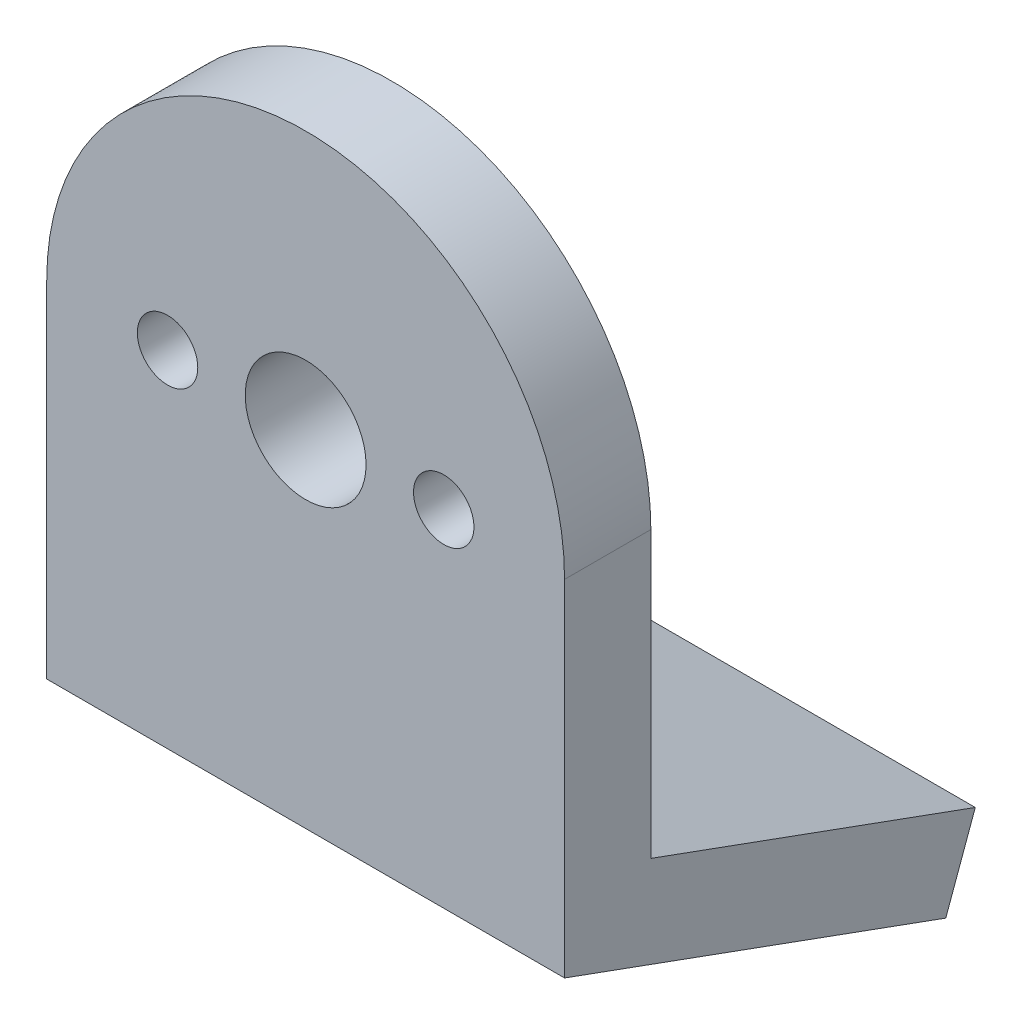
ISO-10303-21;
HEADER;
FILE_DESCRIPTION(('STEP AP214'),'2;1');
FILE_NAME('part.step','',(''),(''),'','','');
FILE_SCHEMA(('AUTOMOTIVE_DESIGN { 1 0 10303 214 1 1 1 1 }'));
ENDSEC;
DATA;
#1=APPLICATION_CONTEXT('core data for automotive mechanical design processes');
#2=APPLICATION_PROTOCOL_DEFINITION('international standard','automotive_design',2000,#1);
#3=PRODUCT_CONTEXT('',#1,'mechanical');
#4=PRODUCT('Part','Part','',(#3));
#5=PRODUCT_RELATED_PRODUCT_CATEGORY('part','',(#4));
#6=PRODUCT_DEFINITION_FORMATION('','',#4);
#7=PRODUCT_DEFINITION_CONTEXT('part definition',#1,'design');
#8=PRODUCT_DEFINITION('design','',#6,#7);
#9=PRODUCT_DEFINITION_SHAPE('','',#8);
#10=(LENGTH_UNIT() NAMED_UNIT(*) SI_UNIT(.MILLI.,.METRE.));
#11=(NAMED_UNIT(*) PLANE_ANGLE_UNIT() SI_UNIT($,.RADIAN.));
#12=(NAMED_UNIT(*) SI_UNIT($,.STERADIAN.) SOLID_ANGLE_UNIT());
#13=UNCERTAINTY_MEASURE_WITH_UNIT(LENGTH_MEASURE(1.E-05),#10,'distance_accuracy_value','');
#14=(GEOMETRIC_REPRESENTATION_CONTEXT(3) GLOBAL_UNCERTAINTY_ASSIGNED_CONTEXT((#13)) GLOBAL_UNIT_ASSIGNED_CONTEXT((#10,
#11,#12)) REPRESENTATION_CONTEXT('',''));
#15=CARTESIAN_POINT('',(0.,0.,0.));
#16=DIRECTION('',(0.,0.,1.));
#17=DIRECTION('',(1.,0.,0.));
#18=AXIS2_PLACEMENT_3D('',#15,#16,#17);
#19=CARTESIAN_POINT('',(-0.959557323541412,10.3488372093023,5.));
#20=DIRECTION('',(0.,0.,1.));
#21=DIRECTION('',(1.,0.,0.));
#22=AXIS2_PLACEMENT_3D('',#19,#20,#21);
#23=PLANE('',#22);
#24=CARTESIAN_POINT('',(7.04044267645859,10.3488372093023,5.));
#25=DIRECTION('',(0.,0.,1.));
#26=DIRECTION('',(1.,0.,0.));
#27=AXIS2_PLACEMENT_3D('',#24,#25,#26);
#28=CIRCLE('',#27,1.75);
#29=CARTESIAN_POINT('',(8.79044267645859,10.3488372093023,5.));
#30=VERTEX_POINT('',#29);
#31=EDGE_CURVE('E111',#30,#30,#28,.T.);
#32=ORIENTED_EDGE('',*,*,#31,.F.);
#33=EDGE_LOOP('',(#32));
#34=FACE_BOUND('',#33,.T.);
#35=CARTESIAN_POINT('',(-0.959557323541412,10.3488372093023,5.));
#36=DIRECTION('',(0.,0.,1.));
#37=DIRECTION('',(1.,0.,0.));
#38=AXIS2_PLACEMENT_3D('',#35,#36,#37);
#39=CIRCLE('',#38,15.);
#40=CARTESIAN_POINT('',(14.0404426764586,10.3488372093023,5.));
#41=VERTEX_POINT('',#40);
#42=CARTESIAN_POINT('',(-15.9595573235414,10.3488372093023,5.));
#43=VERTEX_POINT('',#42);
#44=EDGE_CURVE('E90',#41,#43,#39,.T.);
#45=ORIENTED_EDGE('',*,*,#44,.T.);
#46=DIRECTION('',(0.,-1.,0.));
#47=VECTOR('',#46,1.);
#48=CARTESIAN_POINT('',(-15.9595573235414,10.3488372093023,5.));
#49=LINE('',#48,#47);
#50=CARTESIAN_POINT('',(-15.9595573235414,-9.65116279069768,5.));
#51=VERTEX_POINT('',#50);
#52=EDGE_CURVE('E82',#43,#51,#49,.T.);
#53=ORIENTED_EDGE('',*,*,#52,.T.);
#54=DIRECTION('',(1.,0.,0.));
#55=VECTOR('',#54,1.);
#56=CARTESIAN_POINT('',(-15.9595573235414,-9.65116279069768,5.));
#57=LINE('',#56,#55);
#58=CARTESIAN_POINT('',(14.0404426764586,-9.65116279069768,5.));
#59=VERTEX_POINT('',#58);
#60=EDGE_CURVE('E89',#51,#59,#57,.T.);
#61=ORIENTED_EDGE('',*,*,#60,.T.);
#62=DIRECTION('',(0.,1.,0.));
#63=VECTOR('',#62,1.);
#64=CARTESIAN_POINT('',(14.0404426764586,10.3488372093023,5.));
#65=LINE('',#64,#63);
#66=EDGE_CURVE('E51',#59,#41,#65,.T.);
#67=ORIENTED_EDGE('',*,*,#66,.T.);
#68=EDGE_LOOP('',(#45,#53,#61,#67));
#69=FACE_BOUND('',#68,.T.);
#70=CARTESIAN_POINT('',(-8.95955732354141,10.3488372093023,5.));
#71=DIRECTION('',(0.,0.,1.));
#72=DIRECTION('',(1.,0.,0.));
#73=AXIS2_PLACEMENT_3D('',#70,#71,#72);
#74=CIRCLE('',#73,1.75);
#75=CARTESIAN_POINT('',(-7.20955732354141,10.3488372093023,5.));
#76=VERTEX_POINT('',#75);
#77=EDGE_CURVE('E100',#76,#76,#74,.T.);
#78=ORIENTED_EDGE('',*,*,#77,.F.);
#79=EDGE_LOOP('',(#78));
#80=FACE_BOUND('',#79,.T.);
#81=CARTESIAN_POINT('',(-0.959557323541412,10.3488372093023,5.));
#82=DIRECTION('',(0.,0.,1.));
#83=DIRECTION('',(1.,0.,0.));
#84=AXIS2_PLACEMENT_3D('',#81,#82,#83);
#85=CIRCLE('',#84,3.5);
#86=CARTESIAN_POINT('',(2.54044267645859,10.3488372093023,5.));
#87=VERTEX_POINT('',#86);
#88=EDGE_CURVE('E116',#87,#87,#85,.T.);
#89=ORIENTED_EDGE('',*,*,#88,.F.);
#90=EDGE_LOOP('',(#89));
#91=FACE_BOUND('',#90,.T.);
#92=ADVANCED_FACE('F34',(#34,#69,#80,#91),#23,.T.);
#93=CARTESIAN_POINT('',(-0.959557323541412,10.3488372093023,0.));
#94=DIRECTION('',(0.,0.,1.));
#95=DIRECTION('',(1.,0.,0.));
#96=AXIS2_PLACEMENT_3D('',#93,#94,#95);
#97=PLANE('',#96);
#98=CARTESIAN_POINT('',(7.04044267645859,10.3488372093023,0.));
#99=DIRECTION('',(0.,0.,1.));
#100=DIRECTION('',(1.,0.,0.));
#101=AXIS2_PLACEMENT_3D('',#98,#99,#100);
#102=CIRCLE('',#101,1.75);
#103=CARTESIAN_POINT('',(8.79044267645859,10.3488372093023,0.));
#104=VERTEX_POINT('',#103);
#105=EDGE_CURVE('E113',#104,#104,#102,.T.);
#106=ORIENTED_EDGE('',*,*,#105,.T.);
#107=EDGE_LOOP('',(#106));
#108=FACE_BOUND('',#107,.T.);
#109=DIRECTION('',(0.,1.,0.));
#110=VECTOR('',#109,1.);
#111=CARTESIAN_POINT('',(14.0404426764586,10.3488372093023,0.));
#112=LINE('',#111,#110);
#113=CARTESIAN_POINT('',(14.0404426764586,-6.15012509964911,0.));
#114=VERTEX_POINT('',#113);
#115=CARTESIAN_POINT('',(14.0404426764586,10.3488372093023,0.));
#116=VERTEX_POINT('',#115);
#117=EDGE_CURVE('E96',#114,#116,#112,.T.);
#118=ORIENTED_EDGE('',*,*,#117,.F.);
#119=DIRECTION('',(-1.,0.,0.));
#120=VECTOR('',#119,1.);
#121=CARTESIAN_POINT('',(14.0414426764586,-6.15012509964911,0.));
#122=LINE('',#121,#120);
#123=CARTESIAN_POINT('',(-15.9595573235414,-6.15012509964911,0.));
#124=VERTEX_POINT('',#123);
#125=EDGE_CURVE('E122',#114,#124,#122,.T.);
#126=ORIENTED_EDGE('',*,*,#125,.T.);
#127=DIRECTION('',(0.,-1.,0.));
#128=VECTOR('',#127,1.);
#129=CARTESIAN_POINT('',(-15.9595573235414,10.3488372093023,0.));
#130=LINE('',#129,#128);
#131=CARTESIAN_POINT('',(-15.9595573235414,10.3488372093023,0.));
#132=VERTEX_POINT('',#131);
#133=EDGE_CURVE('E64',#132,#124,#130,.T.);
#134=ORIENTED_EDGE('',*,*,#133,.F.);
#135=CARTESIAN_POINT('',(-0.959557323541412,10.3488372093023,0.));
#136=DIRECTION('',(0.,0.,1.));
#137=DIRECTION('',(1.,0.,0.));
#138=AXIS2_PLACEMENT_3D('',#135,#136,#137);
#139=CIRCLE('',#138,15.);
#140=EDGE_CURVE('E98',#116,#132,#139,.T.);
#141=ORIENTED_EDGE('',*,*,#140,.F.);
#142=EDGE_LOOP('',(#118,#126,#134,#141));
#143=FACE_BOUND('',#142,.T.);
#144=CARTESIAN_POINT('',(-8.95955732354141,10.3488372093023,0.));
#145=DIRECTION('',(0.,0.,1.));
#146=DIRECTION('',(1.,0.,0.));
#147=AXIS2_PLACEMENT_3D('',#144,#145,#146);
#148=CIRCLE('',#147,1.75);
#149=CARTESIAN_POINT('',(-7.20955732354141,10.3488372093023,0.));
#150=VERTEX_POINT('',#149);
#151=EDGE_CURVE('E104',#150,#150,#148,.T.);
#152=ORIENTED_EDGE('',*,*,#151,.T.);
#153=EDGE_LOOP('',(#152));
#154=FACE_BOUND('',#153,.T.);
#155=CARTESIAN_POINT('',(-0.959557323541412,10.3488372093023,0.));
#156=DIRECTION('',(0.,0.,1.));
#157=DIRECTION('',(1.,0.,0.));
#158=AXIS2_PLACEMENT_3D('',#155,#156,#157);
#159=CIRCLE('',#158,3.5);
#160=CARTESIAN_POINT('',(2.54044267645859,10.3488372093023,0.));
#161=VERTEX_POINT('',#160);
#162=EDGE_CURVE('E119',#161,#161,#159,.T.);
#163=ORIENTED_EDGE('',*,*,#162,.T.);
#164=EDGE_LOOP('',(#163));
#165=FACE_BOUND('',#164,.T.);
#166=ADVANCED_FACE('F162',(#108,#143,#154,#165),#97,.F.);
#167=CARTESIAN_POINT('',(-0.959557323541412,10.3488372093023,5.));
#168=DIRECTION('',(0.,0.,-1.));
#169=DIRECTION('',(-1.,0.,0.));
#170=AXIS2_PLACEMENT_3D('',#167,#168,#169);
#171=CYLINDRICAL_SURFACE('',#170,15.);
#172=ORIENTED_EDGE('',*,*,#140,.T.);
#173=DIRECTION('',(0.,0.,-1.));
#174=VECTOR('',#173,1.);
#175=CARTESIAN_POINT('',(-15.9595573235414,10.3488372093023,5.));
#176=LINE('',#175,#174);
#177=EDGE_CURVE('E11',#43,#132,#176,.T.);
#178=ORIENTED_EDGE('',*,*,#177,.F.);
#179=ORIENTED_EDGE('',*,*,#44,.F.);
#180=DIRECTION('',(0.,0.,-1.));
#181=VECTOR('',#180,1.);
#182=CARTESIAN_POINT('',(14.0404426764586,10.3488372093023,5.));
#183=LINE('',#182,#181);
#184=EDGE_CURVE('E43',#41,#116,#183,.T.);
#185=ORIENTED_EDGE('',*,*,#184,.T.);
#186=EDGE_LOOP('',(#172,#178,#179,#185));
#187=FACE_BOUND('',#186,.T.);
#188=ADVANCED_FACE('F36',(#187),#171,.T.);
#189=CARTESIAN_POINT('',(-15.9595573235414,10.3488372093023,5.));
#190=DIRECTION('',(1.,0.,0.));
#191=DIRECTION('',(0.,0.,-1.));
#192=AXIS2_PLACEMENT_3D('',#189,#190,#191);
#193=PLANE('',#192);
#194=ORIENTED_EDGE('',*,*,#133,.T.);
#195=DIRECTION('',(0.,0.342020143325663,0.93969262078591));
#196=VECTOR('',#195,1.);
#197=CARTESIAN_POINT('',(-15.9595573235414,-12.9905279661624,-18.7938524157182));
#198=LINE('',#197,#196);
#199=CARTESIAN_POINT('',(-15.9595573235414,-12.9905279661624,-18.7938524157182));
#200=VERTEX_POINT('',#199);
#201=EDGE_CURVE('E73',#200,#124,#198,.T.);
#202=ORIENTED_EDGE('',*,*,#201,.F.);
#203=DIRECTION('',(0.,0.93969262078591,-0.342020143325663));
#204=VECTOR('',#203,1.);
#205=CARTESIAN_POINT('',(-15.9595573235414,-12.9905279661624,-18.7938524157182));
#206=LINE('',#205,#204);
#207=CARTESIAN_POINT('',(-15.9595573235414,-17.6889910700919,-17.0837516990899));
#208=VERTEX_POINT('',#207);
#209=EDGE_CURVE('E142',#208,#200,#206,.T.);
#210=ORIENTED_EDGE('',*,*,#209,.F.);
#211=DIRECTION('',(0.,0.342020143325664,0.93969262078591));
#212=VECTOR('',#211,1.);
#213=CARTESIAN_POINT('',(-15.9595573235414,-9.65116279069768,5.));
#214=LINE('',#213,#212);
#215=EDGE_CURVE('E88',#208,#51,#214,.T.);
#216=ORIENTED_EDGE('',*,*,#215,.T.);
#217=ORIENTED_EDGE('',*,*,#52,.F.);
#218=ORIENTED_EDGE('',*,*,#177,.T.);
#219=EDGE_LOOP('',(#194,#202,#210,#216,#217,#218));
#220=FACE_BOUND('',#219,.T.);
#221=ADVANCED_FACE('F83',(#220),#193,.F.);
#222=CARTESIAN_POINT('',(14.0404426764586,10.3488372093023,5.));
#223=DIRECTION('',(-1.,0.,0.));
#224=DIRECTION('',(0.,-1.,0.));
#225=AXIS2_PLACEMENT_3D('',#222,#223,#224);
#226=PLANE('',#225);
#227=ORIENTED_EDGE('',*,*,#66,.F.);
#228=DIRECTION('',(0.,0.342020143325664,0.93969262078591));
#229=VECTOR('',#228,1.);
#230=CARTESIAN_POINT('',(14.0404426764586,-9.65116279069768,5.));
#231=LINE('',#230,#229);
#232=CARTESIAN_POINT('',(14.0404426764586,-17.6889910700919,-17.0837516990899));
#233=VERTEX_POINT('',#232);
#234=EDGE_CURVE('E126',#233,#59,#231,.T.);
#235=ORIENTED_EDGE('',*,*,#234,.F.);
#236=DIRECTION('',(0.,-0.93969262078591,0.342020143325663));
#237=VECTOR('',#236,1.);
#238=CARTESIAN_POINT('',(14.0404426764586,-12.9905279661624,-18.7938524157182));
#239=LINE('',#238,#237);
#240=CARTESIAN_POINT('',(14.0404426764586,-12.9905279661624,-18.7938524157182));
#241=VERTEX_POINT('',#240);
#242=EDGE_CURVE('E136',#241,#233,#239,.T.);
#243=ORIENTED_EDGE('',*,*,#242,.F.);
#244=DIRECTION('',(0.,0.342020143325663,0.93969262078591));
#245=VECTOR('',#244,1.);
#246=CARTESIAN_POINT('',(14.0404426764586,-12.9905279661624,-18.7938524157182));
#247=LINE('',#246,#245);
#248=EDGE_CURVE('E130',#241,#114,#247,.T.);
#249=ORIENTED_EDGE('',*,*,#248,.T.);
#250=ORIENTED_EDGE('',*,*,#117,.T.);
#251=ORIENTED_EDGE('',*,*,#184,.F.);
#252=EDGE_LOOP('',(#227,#235,#243,#249,#250,#251));
#253=FACE_BOUND('',#252,.T.);
#254=ADVANCED_FACE('F161',(#253),#226,.F.);
#255=CARTESIAN_POINT('',(-8.95955732354141,10.3488372093023,5.));
#256=DIRECTION('',(0.,0.,-1.));
#257=DIRECTION('',(-1.,0.,0.));
#258=AXIS2_PLACEMENT_3D('',#255,#256,#257);
#259=CYLINDRICAL_SURFACE('',#258,1.75);
#260=ORIENTED_EDGE('',*,*,#77,.T.);
#261=EDGE_LOOP('',(#260));
#262=FACE_BOUND('',#261,.T.);
#263=ORIENTED_EDGE('',*,*,#151,.F.);
#264=EDGE_LOOP('',(#263));
#265=FACE_BOUND('',#264,.T.);
#266=ADVANCED_FACE('F182',(#262,#265),#259,.F.);
#267=CARTESIAN_POINT('',(7.04044267645859,10.3488372093023,5.));
#268=DIRECTION('',(0.,0.,-1.));
#269=DIRECTION('',(-1.,0.,0.));
#270=AXIS2_PLACEMENT_3D('',#267,#268,#269);
#271=CYLINDRICAL_SURFACE('',#270,1.75);
#272=ORIENTED_EDGE('',*,*,#31,.T.);
#273=EDGE_LOOP('',(#272));
#274=FACE_BOUND('',#273,.T.);
#275=ORIENTED_EDGE('',*,*,#105,.F.);
#276=EDGE_LOOP('',(#275));
#277=FACE_BOUND('',#276,.T.);
#278=ADVANCED_FACE('F174',(#274,#277),#271,.F.);
#279=CARTESIAN_POINT('',(-0.959557323541412,10.3488372093023,5.));
#280=DIRECTION('',(0.,0.,-1.));
#281=DIRECTION('',(-1.,0.,0.));
#282=AXIS2_PLACEMENT_3D('',#279,#280,#281);
#283=CYLINDRICAL_SURFACE('',#282,3.5);
#284=ORIENTED_EDGE('',*,*,#88,.T.);
#285=EDGE_LOOP('',(#284));
#286=FACE_BOUND('',#285,.T.);
#287=ORIENTED_EDGE('',*,*,#162,.F.);
#288=EDGE_LOOP('',(#287));
#289=FACE_BOUND('',#288,.T.);
#290=ADVANCED_FACE('F171',(#286,#289),#283,.F.);
#291=CARTESIAN_POINT('',(14.0404426764586,-9.65116279069768,5.));
#292=DIRECTION('',(0.,-0.93969262078591,0.342020143325664));
#293=DIRECTION('',(0.,-0.342020143325664,-0.93969262078591));
#294=AXIS2_PLACEMENT_3D('',#291,#292,#293);
#295=PLANE('',#294);
#296=ORIENTED_EDGE('',*,*,#215,.F.);
#297=DIRECTION('',(-1.,0.,0.));
#298=VECTOR('',#297,1.);
#299=CARTESIAN_POINT('',(-15.9595573235414,-17.6889910700919,-17.0837516990899));
#300=LINE('',#299,#298);
#301=EDGE_CURVE('E133',#233,#208,#300,.T.);
#302=ORIENTED_EDGE('',*,*,#301,.F.);
#303=ORIENTED_EDGE('',*,*,#234,.T.);
#304=ORIENTED_EDGE('',*,*,#60,.F.);
#305=EDGE_LOOP('',(#296,#302,#303,#304));
#306=FACE_BOUND('',#305,.T.);
#307=ADVANCED_FACE('F173',(#306),#295,.T.);
#308=CARTESIAN_POINT('',(-15.9595573235414,-12.9905279661624,-18.7938524157182));
#309=DIRECTION('',(0.,-0.93969262078591,0.342020143325663));
#310=DIRECTION('',(0.,-0.342020143325663,-0.939692620785911));
#311=AXIS2_PLACEMENT_3D('',#308,#309,#310);
#312=PLANE('',#311);
#313=ORIENTED_EDGE('',*,*,#125,.F.);
#314=ORIENTED_EDGE('',*,*,#248,.F.);
#315=DIRECTION('',(1.,0.,0.));
#316=VECTOR('',#315,1.);
#317=CARTESIAN_POINT('',(-15.9595573235414,-12.9905279661624,-18.7938524157182));
#318=LINE('',#317,#316);
#319=EDGE_CURVE('E139',#200,#241,#318,.T.);
#320=ORIENTED_EDGE('',*,*,#319,.F.);
#321=ORIENTED_EDGE('',*,*,#201,.T.);
#322=EDGE_LOOP('',(#313,#314,#320,#321));
#323=FACE_BOUND('',#322,.T.);
#324=ADVANCED_FACE('F158',(#323),#312,.F.);
#325=CARTESIAN_POINT('',(0.,-7.55983083780142,-20.7704645217565));
#326=DIRECTION('',(0.,0.342020143325663,0.939692620785911));
#327=DIRECTION('',(0.,-0.93969262078591,0.342020143325663));
#328=AXIS2_PLACEMENT_3D('',#325,#326,#327);
#329=PLANE('',#328);
#330=ORIENTED_EDGE('',*,*,#209,.T.);
#331=ORIENTED_EDGE('',*,*,#319,.T.);
#332=ORIENTED_EDGE('',*,*,#242,.T.);
#333=ORIENTED_EDGE('',*,*,#301,.T.);
#334=EDGE_LOOP('',(#330,#331,#332,#333));
#335=FACE_BOUND('',#334,.T.);
#336=ADVANCED_FACE('F146',(#335),#329,.F.);
#337=CLOSED_SHELL('',(#92,#166,#188,#221,#254,#266,#278,#290,#307,#324,#336));
#338=MANIFOLD_SOLID_BREP('B2',#337);
#339=ADVANCED_BREP_SHAPE_REPRESENTATION('',(#18,#338),#14);
#340=SHAPE_DEFINITION_REPRESENTATION(#9,#339);
ENDSEC;
END-ISO-10303-21;
